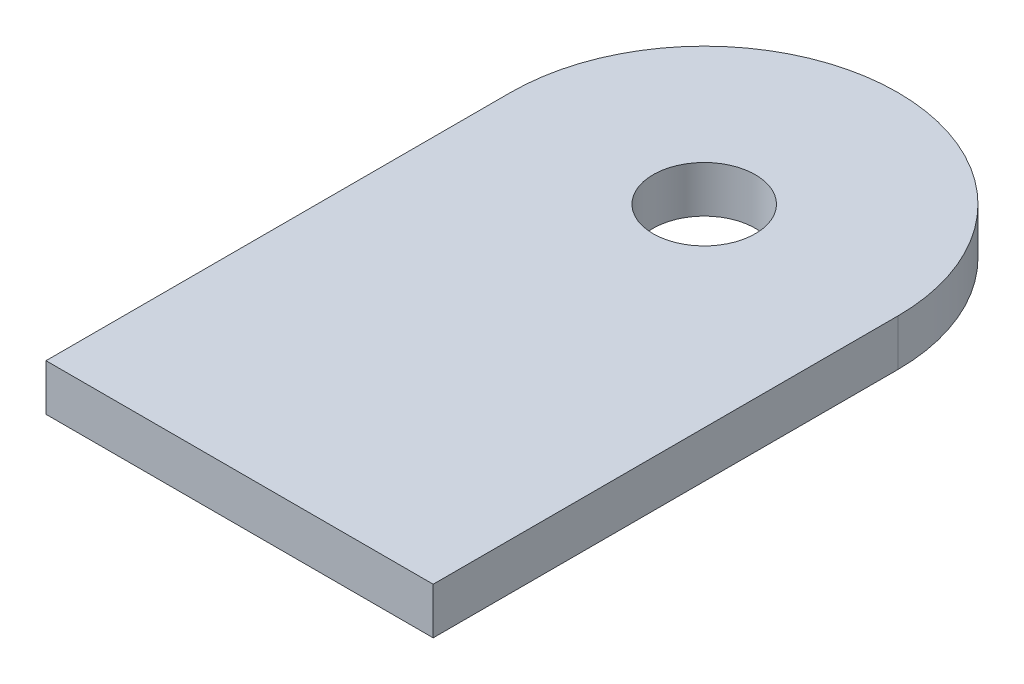
ISO-10303-21;
HEADER;
FILE_DESCRIPTION(('STEP AP214'),'2;1');
FILE_NAME('part.step','',(''),(''),'','','');
FILE_SCHEMA(('AUTOMOTIVE_DESIGN { 1 0 10303 214 1 1 1 1 }'));
ENDSEC;
DATA;
#1=APPLICATION_CONTEXT('core data for automotive mechanical design processes');
#2=APPLICATION_PROTOCOL_DEFINITION('international standard','automotive_design',2000,#1);
#3=PRODUCT_CONTEXT('',#1,'mechanical');
#4=PRODUCT('Part','Part','',(#3));
#5=PRODUCT_RELATED_PRODUCT_CATEGORY('part','',(#4));
#6=PRODUCT_DEFINITION_FORMATION('','',#4);
#7=PRODUCT_DEFINITION_CONTEXT('part definition',#1,'design');
#8=PRODUCT_DEFINITION('design','',#6,#7);
#9=PRODUCT_DEFINITION_SHAPE('','',#8);
#10=(LENGTH_UNIT() NAMED_UNIT(*) SI_UNIT(.MILLI.,.METRE.));
#11=(NAMED_UNIT(*) PLANE_ANGLE_UNIT() SI_UNIT($,.RADIAN.));
#12=(NAMED_UNIT(*) SI_UNIT($,.STERADIAN.) SOLID_ANGLE_UNIT());
#13=UNCERTAINTY_MEASURE_WITH_UNIT(LENGTH_MEASURE(1.E-05),#10,'distance_accuracy_value','');
#14=(GEOMETRIC_REPRESENTATION_CONTEXT(3) GLOBAL_UNCERTAINTY_ASSIGNED_CONTEXT((#13)) GLOBAL_UNIT_ASSIGNED_CONTEXT((#10,
#11,#12)) REPRESENTATION_CONTEXT('',''));
#15=CARTESIAN_POINT('',(0.,0.,0.));
#16=DIRECTION('',(0.,0.,1.));
#17=DIRECTION('',(1.,0.,0.));
#18=AXIS2_PLACEMENT_3D('',#15,#16,#17);
#19=CARTESIAN_POINT('',(2.22,3.,0.));
#20=DIRECTION('',(1.,0.,0.));
#21=DIRECTION('',(0.,0.,-1.));
#22=AXIS2_PLACEMENT_3D('',#19,#20,#21);
#23=PLANE('',#22);
#24=DIRECTION('',(0.,0.,1.));
#25=VECTOR('',#24,1.);
#26=CARTESIAN_POINT('',(2.22,0.,0.));
#27=LINE('',#26,#25);
#28=CARTESIAN_POINT('',(2.22,0.,-39.7974980439846));
#29=VERTEX_POINT('',#28);
#30=CARTESIAN_POINT('',(2.22,0.,-9.79749804398462));
#31=VERTEX_POINT('',#30);
#32=EDGE_CURVE('E113',#29,#31,#27,.T.);
#33=ORIENTED_EDGE('',*,*,#32,.F.);
#34=DIRECTION('',(0.,-1.,0.));
#35=VECTOR('',#34,1.);
#36=CARTESIAN_POINT('',(2.22,3.,-39.7974980439846));
#37=LINE('',#36,#35);
#38=CARTESIAN_POINT('',(2.22,3.,-39.7974980439846));
#39=VERTEX_POINT('',#38);
#40=EDGE_CURVE('E11',#39,#29,#37,.T.);
#41=ORIENTED_EDGE('',*,*,#40,.F.);
#42=DIRECTION('',(0.,0.,1.));
#43=VECTOR('',#42,1.);
#44=CARTESIAN_POINT('',(2.22,3.,0.));
#45=LINE('',#44,#43);
#46=CARTESIAN_POINT('',(2.22,3.,-9.79749804398462));
#47=VERTEX_POINT('',#46);
#48=EDGE_CURVE('E93',#39,#47,#45,.T.);
#49=ORIENTED_EDGE('',*,*,#48,.T.);
#50=DIRECTION('',(0.,-1.,0.));
#51=VECTOR('',#50,1.);
#52=CARTESIAN_POINT('',(2.22,3.,-9.79749804398462));
#53=LINE('',#52,#51);
#54=EDGE_CURVE('E81',#47,#31,#53,.T.);
#55=ORIENTED_EDGE('',*,*,#54,.T.);
#56=EDGE_LOOP('',(#33,#41,#49,#55));
#57=FACE_BOUND('',#56,.T.);
#58=ADVANCED_FACE('F41',(#57),#23,.T.);
#59=CARTESIAN_POINT('',(-10.28,3.,-39.7974980439846));
#60=DIRECTION('',(0.,-1.,0.));
#61=DIRECTION('',(0.,0.,-1.));
#62=AXIS2_PLACEMENT_3D('',#59,#60,#61);
#63=CYLINDRICAL_SURFACE('',#62,12.5);
#64=CARTESIAN_POINT('',(-10.28,0.,-39.7974980439846));
#65=DIRECTION('',(0.,1.,0.));
#66=DIRECTION('',(0.,0.,1.));
#67=AXIS2_PLACEMENT_3D('',#64,#65,#66);
#68=CIRCLE('',#67,12.5);
#69=CARTESIAN_POINT('',(-22.78,0.,-39.7974980439846));
#70=VERTEX_POINT('',#69);
#71=EDGE_CURVE('E99',#29,#70,#68,.T.);
#72=ORIENTED_EDGE('',*,*,#71,.T.);
#73=DIRECTION('',(0.,-1.,0.));
#74=VECTOR('',#73,1.);
#75=CARTESIAN_POINT('',(-22.78,3.,-39.7974980439846));
#76=LINE('',#75,#74);
#77=CARTESIAN_POINT('',(-22.78,3.,-39.7974980439846));
#78=VERTEX_POINT('',#77);
#79=EDGE_CURVE('E50',#78,#70,#76,.T.);
#80=ORIENTED_EDGE('',*,*,#79,.F.);
#81=CARTESIAN_POINT('',(-10.28,3.,-39.7974980439846));
#82=DIRECTION('',(0.,1.,0.));
#83=DIRECTION('',(0.,0.,1.));
#84=AXIS2_PLACEMENT_3D('',#81,#82,#83);
#85=CIRCLE('',#84,12.5);
#86=EDGE_CURVE('E87',#39,#78,#85,.T.);
#87=ORIENTED_EDGE('',*,*,#86,.F.);
#88=ORIENTED_EDGE('',*,*,#40,.T.);
#89=EDGE_LOOP('',(#72,#80,#87,#88));
#90=FACE_BOUND('',#89,.T.);
#91=ADVANCED_FACE('F97',(#90),#63,.T.);
#92=CARTESIAN_POINT('',(-22.78,3.,0.));
#93=DIRECTION('',(1.,0.,0.));
#94=DIRECTION('',(0.,0.,-1.));
#95=AXIS2_PLACEMENT_3D('',#92,#93,#94);
#96=PLANE('',#95);
#97=DIRECTION('',(0.,0.,1.));
#98=VECTOR('',#97,1.);
#99=CARTESIAN_POINT('',(-22.78,0.,0.));
#100=LINE('',#99,#98);
#101=CARTESIAN_POINT('',(-22.78,0.,-9.79749804398462));
#102=VERTEX_POINT('',#101);
#103=EDGE_CURVE('E74',#70,#102,#100,.T.);
#104=ORIENTED_EDGE('',*,*,#103,.T.);
#105=DIRECTION('',(0.,-1.,0.));
#106=VECTOR('',#105,1.);
#107=CARTESIAN_POINT('',(-22.78,3.,-9.79749804398462));
#108=LINE('',#107,#106);
#109=CARTESIAN_POINT('',(-22.78,3.,-9.79749804398462));
#110=VERTEX_POINT('',#109);
#111=EDGE_CURVE('E101',#110,#102,#108,.T.);
#112=ORIENTED_EDGE('',*,*,#111,.F.);
#113=DIRECTION('',(0.,0.,1.));
#114=VECTOR('',#113,1.);
#115=CARTESIAN_POINT('',(-22.78,3.,0.));
#116=LINE('',#115,#114);
#117=EDGE_CURVE('E92',#78,#110,#116,.T.);
#118=ORIENTED_EDGE('',*,*,#117,.F.);
#119=ORIENTED_EDGE('',*,*,#79,.T.);
#120=EDGE_LOOP('',(#104,#112,#118,#119));
#121=FACE_BOUND('',#120,.T.);
#122=ADVANCED_FACE('F102',(#121),#96,.F.);
#123=CARTESIAN_POINT('',(0.,3.,-9.79749804398462));
#124=DIRECTION('',(0.,0.,-1.));
#125=DIRECTION('',(-1.,0.,0.));
#126=AXIS2_PLACEMENT_3D('',#123,#124,#125);
#127=PLANE('',#126);
#128=DIRECTION('',(1.,0.,0.));
#129=VECTOR('',#128,1.);
#130=CARTESIAN_POINT('',(0.,0.,-9.79749804398462));
#131=LINE('',#130,#129);
#132=EDGE_CURVE('E121',#102,#31,#131,.T.);
#133=ORIENTED_EDGE('',*,*,#132,.T.);
#134=ORIENTED_EDGE('',*,*,#54,.F.);
#135=DIRECTION('',(1.,0.,0.));
#136=VECTOR('',#135,1.);
#137=CARTESIAN_POINT('',(0.,3.,-9.79749804398462));
#138=LINE('',#137,#136);
#139=EDGE_CURVE('E58',#110,#47,#138,.T.);
#140=ORIENTED_EDGE('',*,*,#139,.F.);
#141=ORIENTED_EDGE('',*,*,#111,.T.);
#142=EDGE_LOOP('',(#133,#134,#140,#141));
#143=FACE_BOUND('',#142,.T.);
#144=ADVANCED_FACE('F133',(#143),#127,.F.);
#145=CARTESIAN_POINT('',(-10.28,3.,-39.7974980439846));
#146=DIRECTION('',(0.,-1.,0.));
#147=DIRECTION('',(0.,0.,-1.));
#148=AXIS2_PLACEMENT_3D('',#145,#146,#147);
#149=CYLINDRICAL_SURFACE('',#148,3.302);
#150=CARTESIAN_POINT('',(-10.28,3.,-39.7974980439846));
#151=DIRECTION('',(0.,1.,0.));
#152=DIRECTION('',(0.,0.,1.));
#153=AXIS2_PLACEMENT_3D('',#150,#151,#152);
#154=CIRCLE('',#153,3.302);
#155=CARTESIAN_POINT('',(-10.28,3.,-36.4954980439846));
#156=VERTEX_POINT('',#155);
#157=EDGE_CURVE('E106',#156,#156,#154,.T.);
#158=ORIENTED_EDGE('',*,*,#157,.T.);
#159=EDGE_LOOP('',(#158));
#160=FACE_BOUND('',#159,.T.);
#161=CARTESIAN_POINT('',(-10.28,0.,-39.7974980439846));
#162=DIRECTION('',(0.,1.,0.));
#163=DIRECTION('',(0.,0.,1.));
#164=AXIS2_PLACEMENT_3D('',#161,#162,#163);
#165=CIRCLE('',#164,3.302);
#166=CARTESIAN_POINT('',(-10.28,0.,-36.4954980439846));
#167=VERTEX_POINT('',#166);
#168=EDGE_CURVE('E124',#167,#167,#165,.T.);
#169=ORIENTED_EDGE('',*,*,#168,.F.);
#170=EDGE_LOOP('',(#169));
#171=FACE_BOUND('',#170,.T.);
#172=ADVANCED_FACE('F148',(#160,#171),#149,.F.);
#173=CARTESIAN_POINT('',(0.,3.,0.));
#174=DIRECTION('',(0.,1.,0.));
#175=DIRECTION('',(0.,0.,1.));
#176=AXIS2_PLACEMENT_3D('',#173,#174,#175);
#177=PLANE('',#176);
#178=ORIENTED_EDGE('',*,*,#48,.F.);
#179=ORIENTED_EDGE('',*,*,#86,.T.);
#180=ORIENTED_EDGE('',*,*,#117,.T.);
#181=ORIENTED_EDGE('',*,*,#139,.T.);
#182=EDGE_LOOP('',(#178,#179,#180,#181));
#183=FACE_BOUND('',#182,.T.);
#184=ORIENTED_EDGE('',*,*,#157,.F.);
#185=EDGE_LOOP('',(#184));
#186=FACE_BOUND('',#185,.T.);
#187=ADVANCED_FACE('F89',(#183,#186),#177,.T.);
#188=CARTESIAN_POINT('',(0.,0.,0.));
#189=DIRECTION('',(0.,1.,0.));
#190=DIRECTION('',(0.,0.,1.));
#191=AXIS2_PLACEMENT_3D('',#188,#189,#190);
#192=PLANE('',#191);
#193=ORIENTED_EDGE('',*,*,#32,.T.);
#194=ORIENTED_EDGE('',*,*,#132,.F.);
#195=ORIENTED_EDGE('',*,*,#103,.F.);
#196=ORIENTED_EDGE('',*,*,#71,.F.);
#197=EDGE_LOOP('',(#193,#194,#195,#196));
#198=FACE_BOUND('',#197,.T.);
#199=ORIENTED_EDGE('',*,*,#168,.T.);
#200=EDGE_LOOP('',(#199));
#201=FACE_BOUND('',#200,.T.);
#202=ADVANCED_FACE('F135',(#198,#201),#192,.F.);
#203=CLOSED_SHELL('',(#58,#91,#122,#144,#172,#187,#202));
#204=MANIFOLD_SOLID_BREP('B2',#203);
#205=ADVANCED_BREP_SHAPE_REPRESENTATION('',(#18,#204),#14);
#206=SHAPE_DEFINITION_REPRESENTATION(#9,#205);
ENDSEC;
END-ISO-10303-21;
